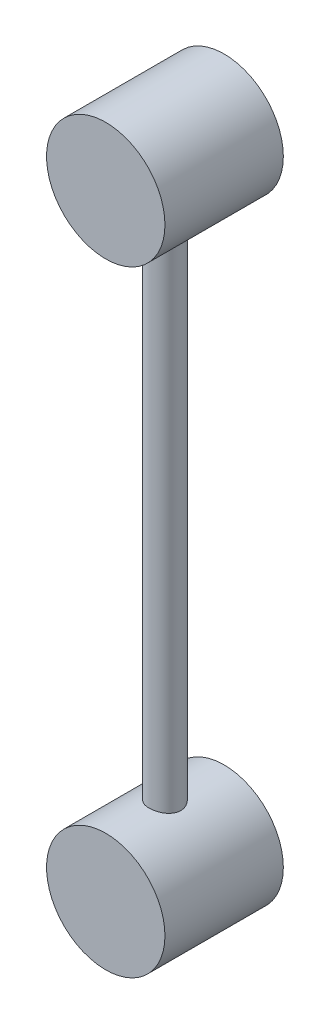
ISO-10303-21;
HEADER;
FILE_DESCRIPTION(('STEP AP214'),'2;1');
FILE_NAME('part.step','',(''),(''),'','','');
FILE_SCHEMA(('AUTOMOTIVE_DESIGN { 1 0 10303 214 1 1 1 1 }'));
ENDSEC;
DATA;
#1=APPLICATION_CONTEXT('core data for automotive mechanical design processes');
#2=APPLICATION_PROTOCOL_DEFINITION('international standard','automotive_design',2000,#1);
#3=PRODUCT_CONTEXT('',#1,'mechanical');
#4=PRODUCT('Part','Part','',(#3));
#5=PRODUCT_RELATED_PRODUCT_CATEGORY('part','',(#4));
#6=PRODUCT_DEFINITION_FORMATION('','',#4);
#7=PRODUCT_DEFINITION_CONTEXT('part definition',#1,'design');
#8=PRODUCT_DEFINITION('design','',#6,#7);
#9=PRODUCT_DEFINITION_SHAPE('','',#8);
#10=(LENGTH_UNIT() NAMED_UNIT(*) SI_UNIT(.MILLI.,.METRE.));
#11=(NAMED_UNIT(*) PLANE_ANGLE_UNIT() SI_UNIT($,.RADIAN.));
#12=(NAMED_UNIT(*) SI_UNIT($,.STERADIAN.) SOLID_ANGLE_UNIT());
#13=UNCERTAINTY_MEASURE_WITH_UNIT(LENGTH_MEASURE(1.E-05),#10,'distance_accuracy_value','');
#14=(GEOMETRIC_REPRESENTATION_CONTEXT(3) GLOBAL_UNCERTAINTY_ASSIGNED_CONTEXT((#13)) GLOBAL_UNIT_ASSIGNED_CONTEXT((#10,
#11,#12)) REPRESENTATION_CONTEXT('',''));
#15=CARTESIAN_POINT('',(0.,0.,0.));
#16=DIRECTION('',(0.,0.,1.));
#17=DIRECTION('',(1.,0.,0.));
#18=AXIS2_PLACEMENT_3D('',#15,#16,#17);
#19=CARTESIAN_POINT('',(0.,78.,0.));
#20=DIRECTION('',(0.,-1.,0.));
#21=DIRECTION('',(0.,0.,-1.));
#22=AXIS2_PLACEMENT_3D('',#19,#20,#21);
#23=CYLINDRICAL_SURFACE('',#22,2.);
#24=CARTESIAN_POINT('',(0.,7.5,-2.));
#25=CARTESIAN_POINT('',(-0.110254555832854,7.49999833810161,-1.99999738306515));
#26=CARTESIAN_POINT('',(-0.22053716022184,7.49754486162151,-1.99085238581033));
#27=CARTESIAN_POINT('',(-0.437925451354464,7.48799573621659,-1.95457876926131));
#28=CARTESIAN_POINT('',(-0.545029583319087,7.48089785332586,-1.92744149557388));
#29=CARTESIAN_POINT('',(-0.752891589045312,7.4628433325279,-1.85612833313597));
#30=CARTESIAN_POINT('',(-0.853657451015285,7.45189167130375,-1.81197441233398));
#31=CARTESIAN_POINT('',(-1.04635368639266,7.42728699151678,-1.70796275733338));
#32=CARTESIAN_POINT('',(-1.13828347044963,7.4136337929518,-1.64810397664071));
#33=CARTESIAN_POINT('',(-1.31282950374002,7.38474614901995,-1.51291648358663));
#34=CARTESIAN_POINT('',(-1.39521168986279,7.36948467678681,-1.43729133199173));
#35=CARTESIAN_POINT('',(-1.54628713660638,7.33927409679591,-1.27335151693665));
#36=CARTESIAN_POINT('',(-1.61497863495664,7.32432502947243,-1.18503522238247));
#37=CARTESIAN_POINT('',(-1.73786409243415,7.29615537464372,-0.996351765174551));
#38=CARTESIAN_POINT('',(-1.79178877736487,7.28296888563239,-0.895803671738272));
#39=CARTESIAN_POINT('',(-1.88187548076994,7.26021477318187,-0.686659888907575));
#40=CARTESIAN_POINT('',(-1.91804077451369,7.25064648253265,-0.578065687668561));
#41=CARTESIAN_POINT('',(-1.97076920226504,7.23649115802399,-0.358504462174985));
#42=CARTESIAN_POINT('',(-1.98775670244692,7.2317964781149,-0.247646460069263));
#43=CARTESIAN_POINT('',(-2.0029703470582,7.22759830916371,-0.0245623166934603));
#44=CARTESIAN_POINT('',(-2.00119999705753,7.22809385014446,0.0876635650240686));
#45=CARTESIAN_POINT('',(-1.97928510002699,7.23412378802031,0.306985415374062));
#46=CARTESIAN_POINT('',(-1.95965406064765,7.23951735511531,0.414137182038488));
#47=CARTESIAN_POINT('',(-1.90339748722183,7.25451013080688,0.623568334456244));
#48=CARTESIAN_POINT('',(-1.86677059492995,7.26410967552612,0.725847330075347));
#49=CARTESIAN_POINT('',(-1.77714356965256,7.28655661748386,0.923968143808577));
#50=CARTESIAN_POINT('',(-1.72396341137784,7.29943942818703,1.01972433928626));
#51=CARTESIAN_POINT('',(-1.60286503823778,7.32698229642445,1.20113415885152));
#52=CARTESIAN_POINT('',(-1.53494392224251,7.34164270355186,1.28678578915647));
#53=CARTESIAN_POINT('',(-1.38366607263419,7.37167510629864,1.4484889974548));
#54=CARTESIAN_POINT('',(-1.29987812728299,7.38705471488831,1.52413631831495));
#55=CARTESIAN_POINT('',(-1.12061766820637,7.41636381276316,1.66038878035029));
#56=CARTESIAN_POINT('',(-1.02514469420509,7.43029324488555,1.72099332870243));
#57=CARTESIAN_POINT('',(-0.824598255497451,7.45521820398293,1.82561790282465));
#58=CARTESIAN_POINT('',(-0.719484902551789,7.4662007283356,1.86956477044859));
#59=CARTESIAN_POINT('',(-0.503002294390395,7.48390044400999,1.93904718881337));
#60=CARTESIAN_POINT('',(-0.391634411928323,7.49061856733749,1.96458676272396));
#61=CARTESIAN_POINT('',(-0.169254083145515,7.49889158558384,1.99589487691783));
#62=CARTESIAN_POINT('',(-0.0583242376413797,7.50058997470959,2.00221303985087));
#63=CARTESIAN_POINT('',(0.163010045901199,7.49904471691695,1.99641683575306));
#64=CARTESIAN_POINT('',(0.273414537062114,7.49580158080353,1.98430437389423));
#65=CARTESIAN_POINT('',(0.48860244990178,7.48483035496021,1.94244155254002));
#66=CARTESIAN_POINT('',(0.593449852027782,7.47718026546329,1.91299775380223));
#67=CARTESIAN_POINT('',(0.796706971176065,7.45826294894139,1.83766405549205));
#68=CARTESIAN_POINT('',(0.895115989216027,7.44699532996161,1.79177237374945));
#69=CARTESIAN_POINT('',(1.08483847466795,7.42175660559528,1.68382611281946));
#70=CARTESIAN_POINT('',(1.17597518846118,7.40773686604957,1.62147253320226));
#71=CARTESIAN_POINT('',(1.34668463539715,7.37861452365564,1.48274836984201));
#72=CARTESIAN_POINT('',(1.42625507879918,7.3635117072752,1.40637501739894));
#73=CARTESIAN_POINT('',(1.57388924478774,7.33339745866705,1.23921442250544));
#74=CARTESIAN_POINT('',(1.64156519249816,7.31840061429312,1.14808143860483));
#75=CARTESIAN_POINT('',(1.76067191185118,7.29066447182728,0.955435303900378));
#76=CARTESIAN_POINT('',(1.81210336122161,7.27792507956316,0.853922586377696));
#77=CARTESIAN_POINT('',(1.89687411586112,7.2562926837321,0.643904692923895));
#78=CARTESIAN_POINT('',(1.93031812253958,7.24737748318009,0.535444188182422));
#79=CARTESIAN_POINT('',(1.97841205118791,7.23439825126801,0.314160680325248));
#80=CARTESIAN_POINT('',(1.99306677602478,7.23033298020014,0.201338799652083));
#81=CARTESIAN_POINT('',(2.00288989653714,7.22761744573589,-0.0214947878837967));
#82=CARTESIAN_POINT('',(1.99868155618109,7.22879397743239,-0.131477320258286));
#83=CARTESIAN_POINT('',(1.97234376000439,7.23602396081087,-0.349103514010029));
#84=CARTESIAN_POINT('',(1.95021476535025,7.24207728699439,-0.456747235500577));
#85=CARTESIAN_POINT('',(1.88902515699699,7.25827571073158,-0.665855752129847));
#86=CARTESIAN_POINT('',(1.8500966107558,7.26838885019644,-0.767361842732184));
#87=CARTESIAN_POINT('',(1.75651554562386,7.29156818136177,-0.962478830534142));
#88=CARTESIAN_POINT('',(1.70186056024617,7.30463483621364,-1.05608848630049));
#89=CARTESIAN_POINT('',(1.57648909268817,7.3327292144046,-1.23573035949662));
#90=CARTESIAN_POINT('',(1.50534729767909,7.3478033310169,-1.32145853497621));
#91=CARTESIAN_POINT('',(1.349830535111,7.37795503783007,-1.47996245166733));
#92=CARTESIAN_POINT('',(1.26545235435875,7.39303262798441,-1.55273503866884));
#93=CARTESIAN_POINT('',(1.08367998108868,7.42187812403968,-1.68479223764686));
#94=CARTESIAN_POINT('',(0.986045961751778,7.43561111314551,-1.74375501064933));
#95=CARTESIAN_POINT('',(0.781888640416888,7.45983810102897,-1.84433741592936));
#96=CARTESIAN_POINT('',(0.675371094696295,7.47033417683594,-1.8859681756636));
#97=CARTESIAN_POINT('',(0.47437470488099,7.48554752513468,-1.94527528541552));
#98=CARTESIAN_POINT('',(0.380762016565035,7.49092770592602,-1.9657493835925));
#99=CARTESIAN_POINT('',(0.191439795317076,7.49815449036456,-1.99311220616706));
#100=CARTESIAN_POINT('',(0.0957304704048601,7.5000014429727,-2.00000227220002));
#101=CARTESIAN_POINT('',(0.,7.5,-2.));
#102=B_SPLINE_CURVE_WITH_KNOTS('',3,(#24,#25,#26,#27,#28,#29,#30,#31,#32,#33,#34,#35,#36,#37,
#38,#39,#40,#41,#42,#43,#44,#45,#46,#47,#48,#49,#50,#51,#52,#53,#54,#55,#56,#57,#58,#59,#60,#61,
#62,#63,#64,#65,#66,#67,#68,#69,#70,#71,#72,#73,#74,#75,#76,#77,#78,#79,#80,#81,#82,#83,#84,#85,
#86,#87,#88,#89,#90,#91,#92,#93,#94,#95,#96,#97,#98,#99,#100,#101),.UNSPECIFIED.,.T.,.F.,(4,2,2,
2,2,2,2,2,2,2,2,2,2,2,2,2,2,2,2,2,2,2,2,2,2,2,2,2,2,2,2,2,2,2,2,2,2,2,4),(0.,0.330412598949569,
0.66098424376145,0.991130552971932,1.32129886708675,1.65834897954967,1.99544244925149,
2.33832582523229,2.681145941297,3.01622158250468,3.3512346040432,3.67691002045997,
4.0026114681294,4.33198673346498,4.6614268811763,5.00161259812322,5.34181171937598,
5.68348809603042,6.02508977190139,6.35682717524547,6.68853028925351,7.01453535642116,
7.34057575775615,7.6730028600455,8.00549568258887,8.34736496382789,8.68921998024107,
9.02906297699387,9.36881908663983,9.69743342403612,10.0260393052059,10.352107654483,
10.67822717123,11.0139433957139,11.3497412433245,11.692722522809,12.0354832614518,
12.3223981899334,12.6092847796638),.UNSPECIFIED.);
#103=CARTESIAN_POINT('',(0.,7.5,-2.));
#104=VERTEX_POINT('',#103);
#105=EDGE_CURVE('E53',#104,#104,#102,.T.);
#106=ORIENTED_EDGE('',*,*,#105,.T.);
#107=EDGE_LOOP('',(#106));
#108=FACE_BOUND('',#107,.T.);
#109=CARTESIAN_POINT('',(0.,70.5,-2.));
#110=CARTESIAN_POINT('',(-0.110254555832854,70.5000016618984,-1.99999738306515));
#111=CARTESIAN_POINT('',(-0.22053716022184,70.5024551383785,-1.99085238581033));
#112=CARTESIAN_POINT('',(-0.437925451354463,70.5120042637834,-1.95457876926131));
#113=CARTESIAN_POINT('',(-0.545029583319087,70.5191021466741,-1.92744149557388));
#114=CARTESIAN_POINT('',(-0.752891589045312,70.5371566674721,-1.85612833313597));
#115=CARTESIAN_POINT('',(-0.853657451015285,70.5481083286962,-1.81197441233398));
#116=CARTESIAN_POINT('',(-1.04635368639266,70.5727130084832,-1.70796275733338));
#117=CARTESIAN_POINT('',(-1.13828347044963,70.5863662070482,-1.64810397664071));
#118=CARTESIAN_POINT('',(-1.31282950374002,70.6152538509801,-1.51291648358663));
#119=CARTESIAN_POINT('',(-1.39521168986278,70.6305153232132,-1.43729133199174));
#120=CARTESIAN_POINT('',(-1.54628713660638,70.6607259032041,-1.27335151693665));
#121=CARTESIAN_POINT('',(-1.61497863495664,70.6756749705276,-1.18503522238247));
#122=CARTESIAN_POINT('',(-1.73786409243415,70.7038446253563,-0.99635176517455));
#123=CARTESIAN_POINT('',(-1.79178877736487,70.7170311143676,-0.895803671738272));
#124=CARTESIAN_POINT('',(-1.88187548076994,70.7397852268181,-0.686659888907574));
#125=CARTESIAN_POINT('',(-1.91804077451369,70.7493535174674,-0.578065687668561));
#126=CARTESIAN_POINT('',(-1.97076920226504,70.763508841976,-0.358504462174985));
#127=CARTESIAN_POINT('',(-1.98775670244692,70.7682035218851,-0.247646460069263));
#128=CARTESIAN_POINT('',(-2.0029703470582,70.7724016908363,-0.0245623166934604));
#129=CARTESIAN_POINT('',(-2.00119999705753,70.7719061498555,0.0876635650240683));
#130=CARTESIAN_POINT('',(-1.97928510002699,70.7658762119797,0.306985415374062));
#131=CARTESIAN_POINT('',(-1.95965406064765,70.7604826448847,0.414137182038487));
#132=CARTESIAN_POINT('',(-1.90339748722183,70.7454898691931,0.623568334456243));
#133=CARTESIAN_POINT('',(-1.86677059492995,70.7358903244739,0.725847330075346));
#134=CARTESIAN_POINT('',(-1.77714356965256,70.7134433825161,0.923968143808576));
#135=CARTESIAN_POINT('',(-1.72396341137784,70.700560571813,1.01972433928626));
#136=CARTESIAN_POINT('',(-1.60286503823778,70.6730177035756,1.20113415885152));
#137=CARTESIAN_POINT('',(-1.53494392224252,70.6583572964481,1.28678578915647));
#138=CARTESIAN_POINT('',(-1.38366607263419,70.6283248937014,1.4484889974548));
#139=CARTESIAN_POINT('',(-1.29987812728299,70.6129452851117,1.52413631831495));
#140=CARTESIAN_POINT('',(-1.12061766820637,70.5836361872368,1.66038878035029));
#141=CARTESIAN_POINT('',(-1.02514469420509,70.5697067551145,1.72099332870243));
#142=CARTESIAN_POINT('',(-0.824598255497451,70.5447817960171,1.82561790282465));
#143=CARTESIAN_POINT('',(-0.719484902551789,70.5337992716644,1.86956477044859));
#144=CARTESIAN_POINT('',(-0.503002294390394,70.51609955599,1.93904718881337));
#145=CARTESIAN_POINT('',(-0.391634411928322,70.5093814326625,1.96458676272396));
#146=CARTESIAN_POINT('',(-0.169254083145514,70.5011084144162,1.99589487691783));
#147=CARTESIAN_POINT('',(-0.0583242376413799,70.4994100252904,2.00221303985087));
#148=CARTESIAN_POINT('',(0.163010045901199,70.500955283083,1.99641683575306));
#149=CARTESIAN_POINT('',(0.273414537062114,70.5041984191965,1.98430437389423));
#150=CARTESIAN_POINT('',(0.488602449901779,70.5151696450398,1.94244155254002));
#151=CARTESIAN_POINT('',(0.593449852027781,70.5228197345367,1.91299775380223));
#152=CARTESIAN_POINT('',(0.796706971176063,70.5417370510586,1.83766405549205));
#153=CARTESIAN_POINT('',(0.895115989216026,70.5530046700384,1.79177237374946));
#154=CARTESIAN_POINT('',(1.08483847466795,70.5782433944047,1.68382611281946));
#155=CARTESIAN_POINT('',(1.17597518846118,70.5922631339504,1.62147253320226));
#156=CARTESIAN_POINT('',(1.34668463539714,70.6213854763444,1.48274836984201));
#157=CARTESIAN_POINT('',(1.42625507879918,70.6364882927248,1.40637501739895));
#158=CARTESIAN_POINT('',(1.57388924478774,70.666602541333,1.23921442250544));
#159=CARTESIAN_POINT('',(1.64156519249816,70.6815993857069,1.14808143860483));
#160=CARTESIAN_POINT('',(1.76067191185118,70.7093355281727,0.955435303900378));
#161=CARTESIAN_POINT('',(1.81210336122161,70.7220749204368,0.853922586377697));
#162=CARTESIAN_POINT('',(1.89687411586112,70.7437073162679,0.643904692923897));
#163=CARTESIAN_POINT('',(1.93031812253958,70.7526225168199,0.535444188182425));
#164=CARTESIAN_POINT('',(1.97841205118791,70.765601748732,0.314160680325251));
#165=CARTESIAN_POINT('',(1.99306677602478,70.7696670197999,0.201338799652086));
#166=CARTESIAN_POINT('',(2.00288989653714,70.7723825542641,-0.0214947878837929));
#167=CARTESIAN_POINT('',(1.99868155618109,70.7712060225676,-0.131477320258282));
#168=CARTESIAN_POINT('',(1.97234376000439,70.7639760391891,-0.349103514010026));
#169=CARTESIAN_POINT('',(1.95021476535025,70.7579227130056,-0.456747235500574));
#170=CARTESIAN_POINT('',(1.88902515699699,70.7417242892684,-0.665855752129845));
#171=CARTESIAN_POINT('',(1.8500966107558,70.7316111498036,-0.767361842732181));
#172=CARTESIAN_POINT('',(1.75651554562386,70.7084318186382,-0.962478830534139));
#173=CARTESIAN_POINT('',(1.70186056024617,70.6953651637864,-1.05608848630049));
#174=CARTESIAN_POINT('',(1.57648909268817,70.6672707855954,-1.23573035949661));
#175=CARTESIAN_POINT('',(1.5053472976791,70.6521966689831,-1.32145853497621));
#176=CARTESIAN_POINT('',(1.349830535111,70.6220449621699,-1.47996245166732));
#177=CARTESIAN_POINT('',(1.26545235435875,70.6069673720156,-1.55273503866884));
#178=CARTESIAN_POINT('',(1.08367998108869,70.5781218759603,-1.68479223764686));
#179=CARTESIAN_POINT('',(0.986045961751779,70.5643888868545,-1.74375501064933));
#180=CARTESIAN_POINT('',(0.78188864041689,70.540161898971,-1.84433741592936));
#181=CARTESIAN_POINT('',(0.675371094696298,70.5296658231641,-1.8859681756636));
#182=CARTESIAN_POINT('',(0.474374704880993,70.5144524748653,-1.94527528541552));
#183=CARTESIAN_POINT('',(0.380762016565037,70.509072294074,-1.9657493835925));
#184=CARTESIAN_POINT('',(0.191439795317077,70.5018455096354,-1.99311220616706));
#185=CARTESIAN_POINT('',(0.0957304704048606,70.4999985570273,-2.00000227220002));
#186=CARTESIAN_POINT('',(0.,70.5,-2.));
#187=B_SPLINE_CURVE_WITH_KNOTS('',3,(#109,#110,#111,#112,#113,#114,#115,#116,#117,#118,#119,
#120,#121,#122,#123,#124,#125,#126,#127,#128,#129,#130,#131,#132,#133,#134,#135,#136,#137,#138,
#139,#140,#141,#142,#143,#144,#145,#146,#147,#148,#149,#150,#151,#152,#153,#154,#155,#156,#157,
#158,#159,#160,#161,#162,#163,#164,#165,#166,#167,#168,#169,#170,#171,#172,#173,#174,#175,#176,
#177,#178,#179,#180,#181,#182,#183,#184,#185,#186),.UNSPECIFIED.,.T.,.F.,(4,2,2,2,2,2,2,2,2,2,2,
2,2,2,2,2,2,2,2,2,2,2,2,2,2,2,2,2,2,2,2,2,2,2,2,2,2,2,4),(0.,0.330412598949569,0.66098424376145,
0.991130552971933,1.32129886708675,1.65834897954967,1.99544244925149,2.33832582523229,
2.681145941297,3.01622158250468,3.3512346040432,3.67691002045997,4.0026114681294,
4.33198673346498,4.6614268811763,5.00161259812322,5.34181171937597,5.68348809603042,
6.02508977190139,6.35682717524547,6.68853028925351,7.01453535642116,7.34057575775614,
7.6730028600455,8.00549568258887,8.34736496382789,8.68921998024107,9.02906297699387,
9.36881908663983,9.69743342403611,10.0260393052059,10.352107654483,10.67822717123,
11.0139433957139,11.3497412433245,11.692722522809,12.0354832614518,12.3223981899334,
12.6092847796638),.UNSPECIFIED.);
#188=CARTESIAN_POINT('',(0.,70.5,-2.));
#189=VERTEX_POINT('',#188);
#190=EDGE_CURVE('E10',#189,#189,#187,.T.);
#191=ORIENTED_EDGE('',*,*,#190,.F.);
#192=EDGE_LOOP('',(#191));
#193=FACE_BOUND('',#192,.T.);
#194=ADVANCED_FACE('F41',(#108,#193),#23,.T.);
#195=CARTESIAN_POINT('',(0.,0.,7.5));
#196=DIRECTION('',(0.,0.,-1.));
#197=DIRECTION('',(-1.,0.,0.));
#198=AXIS2_PLACEMENT_3D('',#195,#196,#197);
#199=CYLINDRICAL_SURFACE('',#198,7.5);
#200=CARTESIAN_POINT('',(0.,0.,7.5));
#201=DIRECTION('',(0.,0.,1.));
#202=DIRECTION('',(1.,0.,0.));
#203=AXIS2_PLACEMENT_3D('',#200,#201,#202);
#204=CIRCLE('',#203,7.5);
#205=CARTESIAN_POINT('',(7.5,0.,7.5));
#206=VERTEX_POINT('',#205);
#207=EDGE_CURVE('E59',#206,#206,#204,.T.);
#208=ORIENTED_EDGE('',*,*,#207,.F.);
#209=EDGE_LOOP('',(#208));
#210=FACE_BOUND('',#209,.T.);
#211=CARTESIAN_POINT('',(0.,0.,-7.5));
#212=DIRECTION('',(0.,0.,1.));
#213=DIRECTION('',(1.,0.,0.));
#214=AXIS2_PLACEMENT_3D('',#211,#212,#213);
#215=CIRCLE('',#214,7.5);
#216=CARTESIAN_POINT('',(7.5,0.,-7.5));
#217=VERTEX_POINT('',#216);
#218=EDGE_CURVE('E62',#217,#217,#215,.T.);
#219=ORIENTED_EDGE('',*,*,#218,.T.);
#220=EDGE_LOOP('',(#219));
#221=FACE_BOUND('',#220,.T.);
#222=ORIENTED_EDGE('',*,*,#105,.F.);
#223=EDGE_LOOP('',(#222));
#224=FACE_BOUND('',#223,.T.);
#225=ADVANCED_FACE('F43',(#210,#221,#224),#199,.T.);
#226=CARTESIAN_POINT('',(0.,0.,7.5));
#227=DIRECTION('',(0.,0.,1.));
#228=DIRECTION('',(1.,0.,0.));
#229=AXIS2_PLACEMENT_3D('',#226,#227,#228);
#230=PLANE('',#229);
#231=ORIENTED_EDGE('',*,*,#207,.T.);
#232=EDGE_LOOP('',(#231));
#233=FACE_BOUND('',#232,.T.);
#234=ADVANCED_FACE('F74',(#233),#230,.T.);
#235=CARTESIAN_POINT('',(0.,0.,-7.5));
#236=DIRECTION('',(0.,0.,1.));
#237=DIRECTION('',(1.,0.,0.));
#238=AXIS2_PLACEMENT_3D('',#235,#236,#237);
#239=PLANE('',#238);
#240=ORIENTED_EDGE('',*,*,#218,.F.);
#241=EDGE_LOOP('',(#240));
#242=FACE_BOUND('',#241,.T.);
#243=ADVANCED_FACE('F77',(#242),#239,.F.);
#244=CARTESIAN_POINT('',(0.,78.,7.5));
#245=DIRECTION('',(0.,0.,-1.));
#246=DIRECTION('',(-1.,0.,0.));
#247=AXIS2_PLACEMENT_3D('',#244,#245,#246);
#248=CYLINDRICAL_SURFACE('',#247,7.5);
#249=CARTESIAN_POINT('',(0.,78.,-7.5));
#250=DIRECTION('',(0.,0.,1.));
#251=DIRECTION('',(1.,0.,0.));
#252=AXIS2_PLACEMENT_3D('',#249,#250,#251);
#253=CIRCLE('',#252,7.5);
#254=CARTESIAN_POINT('',(7.5,78.,-7.5));
#255=VERTEX_POINT('',#254);
#256=EDGE_CURVE('E95',#255,#255,#253,.T.);
#257=ORIENTED_EDGE('',*,*,#256,.T.);
#258=EDGE_LOOP('',(#257));
#259=FACE_BOUND('',#258,.T.);
#260=CARTESIAN_POINT('',(0.,78.,7.5));
#261=DIRECTION('',(0.,0.,1.));
#262=DIRECTION('',(1.,0.,0.));
#263=AXIS2_PLACEMENT_3D('',#260,#261,#262);
#264=CIRCLE('',#263,7.5);
#265=CARTESIAN_POINT('',(7.5,78.,7.5));
#266=VERTEX_POINT('',#265);
#267=EDGE_CURVE('E89',#266,#266,#264,.T.);
#268=ORIENTED_EDGE('',*,*,#267,.F.);
#269=EDGE_LOOP('',(#268));
#270=FACE_BOUND('',#269,.T.);
#271=ORIENTED_EDGE('',*,*,#190,.T.);
#272=EDGE_LOOP('',(#271));
#273=FACE_BOUND('',#272,.T.);
#274=ADVANCED_FACE('F72',(#259,#270,#273),#248,.T.);
#275=CARTESIAN_POINT('',(0.,78.,7.5));
#276=DIRECTION('',(0.,0.,1.));
#277=DIRECTION('',(1.,0.,0.));
#278=AXIS2_PLACEMENT_3D('',#275,#276,#277);
#279=PLANE('',#278);
#280=ORIENTED_EDGE('',*,*,#267,.T.);
#281=EDGE_LOOP('',(#280));
#282=FACE_BOUND('',#281,.T.);
#283=ADVANCED_FACE('F82',(#282),#279,.T.);
#284=CARTESIAN_POINT('',(0.,78.,-7.5));
#285=DIRECTION('',(0.,0.,1.));
#286=DIRECTION('',(1.,0.,0.));
#287=AXIS2_PLACEMENT_3D('',#284,#285,#286);
#288=PLANE('',#287);
#289=ORIENTED_EDGE('',*,*,#256,.F.);
#290=EDGE_LOOP('',(#289));
#291=FACE_BOUND('',#290,.T.);
#292=ADVANCED_FACE('F101',(#291),#288,.F.);
#293=CLOSED_SHELL('',(#194,#225,#234,#243,#274,#283,#292));
#294=MANIFOLD_SOLID_BREP('B2',#293);
#295=ADVANCED_BREP_SHAPE_REPRESENTATION('',(#18,#294),#14);
#296=SHAPE_DEFINITION_REPRESENTATION(#9,#295);
ENDSEC;
END-ISO-10303-21;
